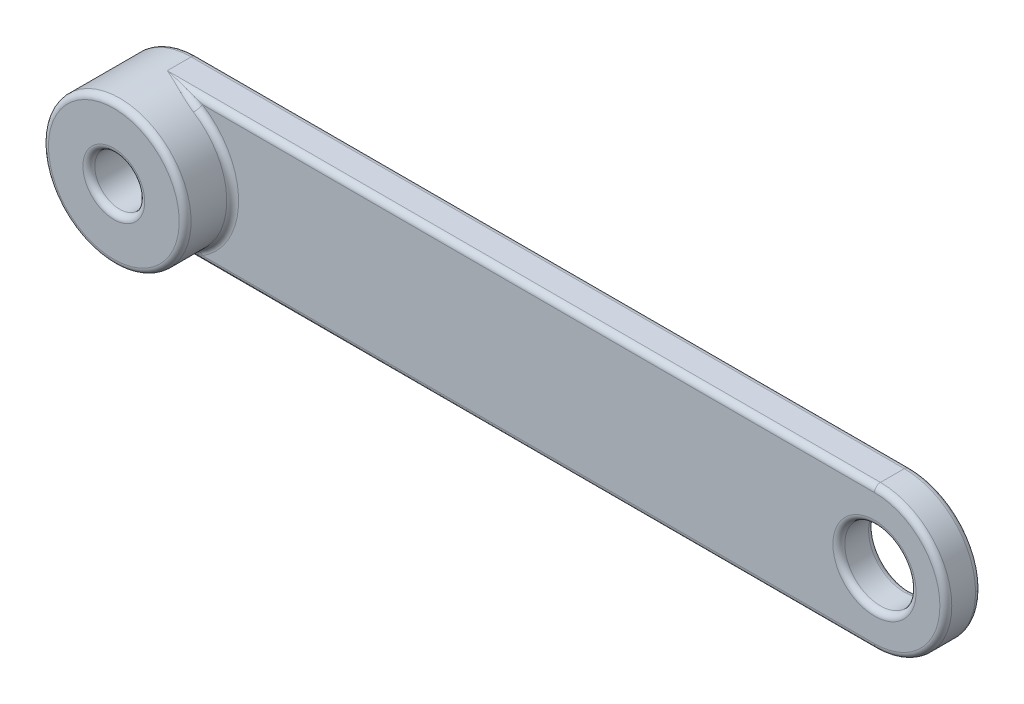
ISO-10303-21;
HEADER;
FILE_DESCRIPTION(('STEP AP214'),'2;1');
FILE_NAME('part.step','',(''),(''),'','','');
FILE_SCHEMA(('AUTOMOTIVE_DESIGN { 1 0 10303 214 1 1 1 1 }'));
ENDSEC;
DATA;
#1=APPLICATION_CONTEXT('core data for automotive mechanical design processes');
#2=APPLICATION_PROTOCOL_DEFINITION('international standard','automotive_design',2000,#1);
#3=PRODUCT_CONTEXT('',#1,'mechanical');
#4=PRODUCT('Part','Part','',(#3));
#5=PRODUCT_RELATED_PRODUCT_CATEGORY('part','',(#4));
#6=PRODUCT_DEFINITION_FORMATION('','',#4);
#7=PRODUCT_DEFINITION_CONTEXT('part definition',#1,'design');
#8=PRODUCT_DEFINITION('design','',#6,#7);
#9=PRODUCT_DEFINITION_SHAPE('','',#8);
#10=(LENGTH_UNIT() NAMED_UNIT(*) SI_UNIT(.MILLI.,.METRE.));
#11=(NAMED_UNIT(*) PLANE_ANGLE_UNIT() SI_UNIT($,.RADIAN.));
#12=(NAMED_UNIT(*) SI_UNIT($,.STERADIAN.) SOLID_ANGLE_UNIT());
#13=UNCERTAINTY_MEASURE_WITH_UNIT(LENGTH_MEASURE(1.E-05),#10,'distance_accuracy_value','');
#14=(GEOMETRIC_REPRESENTATION_CONTEXT(3) GLOBAL_UNCERTAINTY_ASSIGNED_CONTEXT((#13)) GLOBAL_UNIT_ASSIGNED_CONTEXT((#10,
#11,#12)) REPRESENTATION_CONTEXT('',''));
#15=CARTESIAN_POINT('',(0.,0.,0.));
#16=DIRECTION('',(0.,0.,1.));
#17=DIRECTION('',(1.,0.,0.));
#18=AXIS2_PLACEMENT_3D('',#15,#16,#17);
#19=CARTESIAN_POINT('',(-30.,0.,1.5));
#20=DIRECTION('',(0.,0.,-1.));
#21=DIRECTION('',(-1.,0.,0.));
#22=AXIS2_PLACEMENT_3D('',#19,#20,#21);
#23=CYLINDRICAL_SURFACE('',#22,6.);
#24=CARTESIAN_POINT('',(-30.,0.,5.));
#25=DIRECTION('',(0.,0.,-1.));
#26=DIRECTION('',(-1.,0.,0.));
#27=AXIS2_PLACEMENT_3D('',#24,#25,#26);
#28=CIRCLE('',#27,6.);
#29=CARTESIAN_POINT('',(-36.,0.,5.));
#30=VERTEX_POINT('',#29);
#31=EDGE_CURVE('E153',#30,#30,#28,.T.);
#32=ORIENTED_EDGE('',*,*,#31,.T.);
#33=EDGE_LOOP('',(#32));
#34=FACE_BOUND('',#33,.T.);
#35=DIRECTION('',(0.,0.,-1.));
#36=VECTOR('',#35,1.);
#37=CARTESIAN_POINT('',(-30.,6.00000000000001,1.5));
#38=LINE('',#37,#36);
#39=CARTESIAN_POINT('',(-30.,6.00000000000001,1.));
#40=VERTEX_POINT('',#39);
#41=CARTESIAN_POINT('',(-30.,6.,-0.999999999999999));
#42=VERTEX_POINT('',#41);
#43=EDGE_CURVE('E339',#40,#42,#38,.T.);
#44=ORIENTED_EDGE('',*,*,#43,.T.);
#45=CARTESIAN_POINT('',(-30.,0.,-0.999999999999999));
#46=DIRECTION('',(0.,0.,-1.));
#47=DIRECTION('',(-1.,0.,0.));
#48=AXIS2_PLACEMENT_3D('',#45,#46,#47);
#49=CIRCLE('',#48,6.);
#50=CARTESIAN_POINT('',(-30.,-6.00000000000001,-1.));
#51=VERTEX_POINT('',#50);
#52=EDGE_CURVE('E125',#42,#51,#49,.F.);
#53=ORIENTED_EDGE('',*,*,#52,.T.);
#54=DIRECTION('',(0.,0.,-1.));
#55=VECTOR('',#54,1.);
#56=CARTESIAN_POINT('',(-30.,-6.00000000000001,1.5));
#57=LINE('',#56,#55);
#58=CARTESIAN_POINT('',(-30.,-6.00000000000001,1.));
#59=VERTEX_POINT('',#58);
#60=EDGE_CURVE('E359',#59,#51,#57,.T.);
#61=ORIENTED_EDGE('',*,*,#60,.F.);
#62=CARTESIAN_POINT('',(-25.8268408840023,-5.2417234493702,1.4281275784095));
#63=CARTESIAN_POINT('',(-26.3583472022783,-4.77637344463434,1.1473958523543));
#64=CARTESIAN_POINT('',(-26.1478531236945,-4.60010482960654,1.85625515681899));
#65=CARTESIAN_POINT('',(-25.8673671934308,-5.2586965378651,1.43835454177282));
#66=CARTESIAN_POINT('',(-26.372872471598,-4.78568212542629,1.17776714933696));
#67=CARTESIAN_POINT('',(-26.185262024713,-4.63143976220089,1.87670908356606));
#68=CARTESIAN_POINT('',(-25.9090309722364,-5.27571566997727,1.44726047927923));
#69=CARTESIAN_POINT('',(-26.3910628459744,-4.79815975194874,1.20769019053175));
#70=CARTESIAN_POINT('',(-26.2237208974781,-4.66285969837828,1.89452095857847));
#71=CARTESIAN_POINT('',(-25.9941839317077,-5.30960809533619,1.46270853892782));
#72=CARTESIAN_POINT('',(-26.4333157613817,-4.82770579735428,1.26427303137202));
#73=CARTESIAN_POINT('',(-26.302323629337,-4.72543032975726,1.92541707786636));
#74=CARTESIAN_POINT('',(-26.0376696969826,-5.32648159572286,1.46925488079843));
#75=CARTESIAN_POINT('',(-26.4571741461562,-4.84461378336566,1.29106524661812));
#76=CARTESIAN_POINT('',(-26.3424643357624,-4.75658140737101,1.93850976159872));
#77=CARTESIAN_POINT('',(-26.1697780837766,-5.37638026134648,1.48573826261766));
#78=CARTESIAN_POINT('',(-26.534395580874,-4.89897560214354,1.36404872526141));
#79=CARTESIAN_POINT('',(-26.4644105389578,-4.84870202083378,1.97147652524749));
#80=CARTESIAN_POINT('',(-26.2606434346254,-5.40893272140954,1.49265759646182));
#81=CARTESIAN_POINT('',(-26.595430798128,-4.94154108186714,1.40656030700251));
#82=CARTESIAN_POINT('',(-26.5482862473656,-4.90879887027987,1.98531519299122));
#83=CARTESIAN_POINT('',(-26.4134752909856,-5.46072669076056,1.49887527568896));
#84=CARTESIAN_POINT('',(-26.7074093848877,-5.01616008878756,1.46398630583139));
#85=CARTESIAN_POINT('',(-26.6893618070512,-5.00441850602902,1.99775055133412));
#86=CARTESIAN_POINT('',(-26.4743561226722,-5.48062041523498,1.49999883563985));
#87=CARTESIAN_POINT('',(-26.7534928343281,-5.04614544219106,1.48333745346678));
#88=CARTESIAN_POINT('',(-26.7455594978471,-5.04114538195593,1.99999767114047));
#89=CARTESIAN_POINT('',(-26.6289831336316,-5.52931227606701,1.50000176113402));
#90=CARTESIAN_POINT('',(-26.8733206021174,-5.12160370091638,1.52418941490809));
#91=CARTESIAN_POINT('',(-26.8882921233585,-5.13103804814845,2.00000352247864));
#92=CARTESIAN_POINT('',(-26.7235810755598,-5.55744832471949,1.49743575238046));
#93=CARTESIAN_POINT('',(-26.9505590496853,-5.16820580350775,1.54284316223929));
#94=CARTESIAN_POINT('',(-26.9756133005201,-5.18298152270507,1.994871505719));
#95=CARTESIAN_POINT('',(-26.914931107936,-5.61113776116167,1.48825118000046));
#96=CARTESIAN_POINT('',(-27.1111991972513,-5.2597571019407,1.56864425939782));
#97=CARTESIAN_POINT('',(-27.1522440996335,-5.28210048230655,1.9765023610341));
#98=CARTESIAN_POINT('',(-27.0116854995996,-5.63668821122262,1.48162806565832));
#99=CARTESIAN_POINT('',(-27.1947072476474,-5.30497014855636,1.57630037178346));
#100=CARTESIAN_POINT('',(-27.2415558457843,-5.32927054385192,1.96325613167586));
#101=CARTESIAN_POINT('',(-27.3051803854011,-5.7095494740419,1.45687863424466));
#102=CARTESIAN_POINT('',(-27.4478519633026,-5.43367409033778,1.58508002276793));
#103=CARTESIAN_POINT('',(-27.5124742019086,-5.46378364427197,1.91375726776781));
#104=CARTESIAN_POINT('',(-27.5043481433092,-5.75281817237951,1.43388757204404));
#105=CARTESIAN_POINT('',(-27.6296713116609,-5.51607846569451,1.57405141840404));
#106=CARTESIAN_POINT('',(-27.6963213630545,-5.54366431821186,1.86777514391479));
#107=CARTESIAN_POINT('',(-27.8653562444533,-5.8209409077268,1.38519217328389));
#108=CARTESIAN_POINT('',(-27.9642061406852,-5.64662435934083,1.53188622600754));
#109=CARTESIAN_POINT('',(-28.0295596102646,-5.66942936813278,1.77038434670608));
#110=CARTESIAN_POINT('',(-28.0266105291593,-5.84774915638199,1.36097386601165));
#111=CARTESIAN_POINT('',(-28.1153382598131,-5.69895233175846,1.50593615186114));
#112=CARTESIAN_POINT('',(-28.178409719224,-5.71892151948061,1.72194773206113));
#113=CARTESIAN_POINT('',(-28.3506697671448,-5.89476439851586,1.30885717255693));
#114=CARTESIAN_POINT('',(-28.4201181333635,-5.79067626066335,1.44363937827826));
#115=CARTESIAN_POINT('',(-28.4775413235182,-5.80571888956158,1.617714345076));
#116=CARTESIAN_POINT('',(-28.5134757372153,-5.91496670612985,1.28095619371133));
#117=CARTESIAN_POINT('',(-28.5749512864212,-5.83081276881281,1.40732746015369));
#118=CARTESIAN_POINT('',(-28.6278237574295,-5.84301545746757,1.56191238740966));
#119=CARTESIAN_POINT('',(-29.0025663998118,-5.96581527756157,1.19375640344163));
#120=CARTESIAN_POINT('',(-29.0356799341919,-5.93016135558233,1.28967239825727));
#121=CARTESIAN_POINT('',(-29.0792920613647,-5.93688974319644,1.38751280690919));
#122=CARTESIAN_POINT('',(-29.3304768365896,-5.98687963922541,1.13081741364892));
#123=CARTESIAN_POINT('',(-29.3549034633228,-5.97359987418577,1.19600869864387));
#124=CARTESIAN_POINT('',(-29.3819786183904,-5.9757777955035,1.26163482730256));
#125=CARTESIAN_POINT('',(-29.7672144038785,-5.99837220310204,1.04564475566124));
#126=CARTESIAN_POINT('',(-29.7760007242307,-5.99676311743804,1.06851877425367));
#127=CARTESIAN_POINT('',(-29.7851209881955,-5.99699483649918,1.09128951132188));
#128=CARTESIAN_POINT('',(-29.8760954071364,-5.99986561989369,1.02429932736857));
#129=CARTESIAN_POINT('',(-29.8808536382594,-5.99973215836689,1.03645125822823));
#130=CARTESIAN_POINT('',(-29.8856265296643,-5.99975191365006,1.0485986547371));
#131=CARTESIAN_POINT('',(-29.9899925634816,-5.99999710987088,1.00196262513987));
#132=CARTESIAN_POINT('',(-29.9903774426869,-5.99999417667157,1.00294392982162));
#133=CARTESIAN_POINT('',(-29.9907623662907,-5.99999466437702,1.00392525027975));
#134=CARTESIAN_POINT('',(-29.9949962676414,-5.99999999863019,1.00098131825672));
#135=CARTESIAN_POINT('',(-29.9951887124621,-5.99999995300205,1.00147196401252));
#136=CARTESIAN_POINT('',(-29.9953811701305,-5.99999999747114,1.00196263651345));
#137=CARTESIAN_POINT('',(-30.,-5.99999999999999,1.));
#138=CARTESIAN_POINT('',(-30.,-5.99999999999999,1.));
#139=CARTESIAN_POINT('',(-30.,-6.,1.));
#140=(BOUNDED_SURFACE() B_SPLINE_SURFACE(3,2,((#62,#63,#64),(#65,#66,#67),(#68,#69,#70),(#71,
#72,#73),(#74,#75,#76),(#77,#78,#79),(#80,#81,#82),(#83,#84,#85),(#86,#87,#88),(#89,#90,#91),
(#92,#93,#94),(#95,#96,#97),(#98,#99,#100),(#101,#102,#103),(#104,#105,#106),(#107,#108,#109),
(#110,#111,#112),(#113,#114,#115),(#116,#117,#118),(#119,#120,#121),(#122,#123,#124),(#125,#126,
#127),(#128,#129,#130),(#131,#132,#133),(#134,#135,#136),(#137,#138,#139)),.UNSPECIFIED.,.F.,
.F.,.F.) B_SPLINE_SURFACE_WITH_KNOTS((4,2,2,2,2,2,2,2,2,2,2,2,4),(3,3),(0.,0.16984709042055,
0.339388913804842,0.676038526408734,0.894192400445608,1.22415749817049,1.55449338582018,
2.21798174140298,2.7474553691667,3.27730376361803,4.33386759061956,4.68478059100202,
4.70090511581507),(0.,1.),
.UNSPECIFIED.) GEOMETRIC_REPRESENTATION_ITEM() RATIONAL_B_SPLINE_SURFACE(((1.,0.549530222413328,
1.),(1.,0.560143299283935,1.),(1.,0.570719244706879,1.),(1.,0.591670480785608,1.),(1.,
0.602046097915688,1.),(1.,0.632593871750217,1.),(1.,0.652342083902754,1.),(1.,0.683568803832132,
1.),(1.,0.695511447475862,1.),(1.,0.724645114795777,1.),(1.,0.74138888720478,1.),(1.,
0.773221470254066,1.),(1.,0.788308400029641,1.),(1.,0.831213767976823,1.),(1.,0.856526967259593,
1.),(1.,0.896262729252152,1.),(1.,0.911852310831275,1.),(1.,0.939147496412512,1.),(1.,
0.950850343486455,1.),(1.,0.980280004949531,1.),(1.,0.992430307527187,1.),(1.,0.999060631586975,
1.),(1.,0.99992246197761,1.),(1.,0.999998333124029,1.),(1.,0.999999999731678,1.),(1.,1.,1.))) REPRESENTATION_ITEM('') SURFACE());
#141=CARTESIAN_POINT('',(-26.1478531236945,-4.60010482960654,1.85625515681899));
#142=CARTESIAN_POINT('',(-26.185262024713,-4.63143976220089,1.87670908356606));
#143=CARTESIAN_POINT('',(-26.2237208974781,-4.66285969837828,1.89452095857847));
#144=CARTESIAN_POINT('',(-26.302323629337,-4.72543032975726,1.92541707786636));
#145=CARTESIAN_POINT('',(-26.3424643357624,-4.75658140737101,1.93850976159872));
#146=CARTESIAN_POINT('',(-26.4644105389578,-4.84870202083378,1.97147652524749));
#147=CARTESIAN_POINT('',(-26.5482862473656,-4.90879887027987,1.98531519299122));
#148=CARTESIAN_POINT('',(-26.6893618070512,-5.00441850602902,1.99775055133412));
#149=CARTESIAN_POINT('',(-26.7455594978471,-5.04114538195593,1.99999767114047));
#150=CARTESIAN_POINT('',(-26.8882921233585,-5.13103804814845,2.00000352247864));
#151=CARTESIAN_POINT('',(-26.9756133005201,-5.18298152270507,1.994871505719));
#152=CARTESIAN_POINT('',(-27.1522440996335,-5.28210048230655,1.9765023610341));
#153=CARTESIAN_POINT('',(-27.2415558457843,-5.32927054385192,1.96325613167586));
#154=CARTESIAN_POINT('',(-27.5124742019086,-5.46378364427197,1.91375726776781));
#155=CARTESIAN_POINT('',(-27.6963213630546,-5.54366431821186,1.86777514391479));
#156=CARTESIAN_POINT('',(-28.0295596102646,-5.66942936813278,1.77038434670608));
#157=CARTESIAN_POINT('',(-28.178409719224,-5.71892151948061,1.72194773206113));
#158=CARTESIAN_POINT('',(-28.4775413235182,-5.80571888956158,1.617714345076));
#159=CARTESIAN_POINT('',(-28.6278237574295,-5.84301545746757,1.56191238740966));
#160=CARTESIAN_POINT('',(-29.0792920613647,-5.93688974319644,1.38751280690919));
#161=CARTESIAN_POINT('',(-29.3819786183904,-5.97577779550351,1.26163482730256));
#162=CARTESIAN_POINT('',(-29.7851209881955,-5.99699483649918,1.09128951132188));
#163=CARTESIAN_POINT('',(-29.8856265296643,-5.99975191365006,1.0485986547371));
#164=CARTESIAN_POINT('',(-29.9907623662907,-5.99999466437702,1.00392525027975));
#165=CARTESIAN_POINT('',(-29.9953811701305,-5.99999999747114,1.00196263651345));
#166=CARTESIAN_POINT('',(-30.,-6.,1.));
#167=B_SPLINE_CURVE_WITH_KNOTS('',3,(#141,#142,#143,#144,#145,#146,#147,#148,#149,#150,#151,
#152,#153,#154,#155,#156,#157,#158,#159,#160,#161,#162,#163,#164,#165,#166),.UNSPECIFIED.,.F.,
.F.,(4,2,2,2,2,2,2,2,2,2,2,2,4),(0.,0.16984709042055,0.339388913804842,0.676038526408734,
0.894192400445608,1.22415749817049,1.55449338582018,2.21798174140298,2.7474553691667,
3.27730376361803,4.33386759061956,4.68478059100202,4.70090511581507),.UNSPECIFIED.);
#168=CARTESIAN_POINT('',(-26.8023677398729,-5.07692307692306,2.));
#169=VERTEX_POINT('',#168);
#170=EDGE_CURVE('E209',#59,#169,#167,.F.);
#171=ORIENTED_EDGE('',*,*,#170,.T.);
#172=CARTESIAN_POINT('',(-30.,0.,2.));
#173=DIRECTION('',(0.,0.,-1.));
#174=DIRECTION('',(-1.,0.,0.));
#175=AXIS2_PLACEMENT_3D('',#172,#173,#174);
#176=CIRCLE('',#175,6.);
#177=CARTESIAN_POINT('',(-26.8023677398729,5.07692307692308,2.));
#178=VERTEX_POINT('',#177);
#179=EDGE_CURVE('E149',#169,#178,#176,.F.);
#180=ORIENTED_EDGE('',*,*,#179,.T.);
#181=CARTESIAN_POINT('',(-26.1478531236945,4.60010482960654,1.85625515681899));
#182=CARTESIAN_POINT('',(-26.3583472022783,4.77637344463433,1.14739585235427));
#183=CARTESIAN_POINT('',(-25.8268408840023,5.24172344937021,1.42812757840949));
#184=CARTESIAN_POINT('',(-26.185262024713,4.63143976220088,1.87670908356605));
#185=CARTESIAN_POINT('',(-26.372872471598,4.78568212542629,1.17776714933692));
#186=CARTESIAN_POINT('',(-25.8673671934307,5.2586965378651,1.43835454177281));
#187=CARTESIAN_POINT('',(-26.2237208974781,4.66285969837827,1.89452095857846));
#188=CARTESIAN_POINT('',(-26.3910628459744,4.79815975194874,1.20769019053171));
#189=CARTESIAN_POINT('',(-25.9090309722364,5.27571566997727,1.44726047927922));
#190=CARTESIAN_POINT('',(-26.302323629337,4.72543032975723,1.92541707786634));
#191=CARTESIAN_POINT('',(-26.4333157613816,4.82770579735426,1.26427303137197));
#192=CARTESIAN_POINT('',(-25.9941839317076,5.30960809533618,1.46270853892781));
#193=CARTESIAN_POINT('',(-26.3424643357623,4.75658140737097,1.9385097615987));
#194=CARTESIAN_POINT('',(-26.4571741461562,4.84461378336563,1.29106524661806));
#195=CARTESIAN_POINT('',(-26.0376696969825,5.32648159572284,1.46925488079842));
#196=CARTESIAN_POINT('',(-26.4644105389578,4.84870202083375,1.97147652524748));
#197=CARTESIAN_POINT('',(-26.5343955808739,4.89897560214351,1.36404872526137));
#198=CARTESIAN_POINT('',(-26.1697780837766,5.37638026134646,1.48573826261765));
#199=CARTESIAN_POINT('',(-26.5482862473656,4.90879887027986,1.98531519299122));
#200=CARTESIAN_POINT('',(-26.595430798128,4.94154108186713,1.40656030700249));
#201=CARTESIAN_POINT('',(-26.2606434346254,5.40893272140954,1.49265759646182));
#202=CARTESIAN_POINT('',(-26.6893618070512,5.00441850602902,1.99775055133412));
#203=CARTESIAN_POINT('',(-26.7074093848877,5.01616008878756,1.46398630583139));
#204=CARTESIAN_POINT('',(-26.4134752909855,5.46072669076057,1.49887527568896));
#205=CARTESIAN_POINT('',(-26.7455594978471,5.04114538195593,1.99999767114048));
#206=CARTESIAN_POINT('',(-26.7534928343281,5.04614544219106,1.48333745346678));
#207=CARTESIAN_POINT('',(-26.4743561226722,5.48062041523498,1.49999883563985));
#208=CARTESIAN_POINT('',(-26.8882921233585,5.13103804814843,2.00000352247864));
#209=CARTESIAN_POINT('',(-26.8733206021173,5.12160370091636,1.52418941490807));
#210=CARTESIAN_POINT('',(-26.6289831336315,5.52931227606701,1.50000176113402));
#211=CARTESIAN_POINT('',(-26.97561330052,5.18298152270504,1.994871505719));
#212=CARTESIAN_POINT('',(-26.9505590496853,5.16820580350771,1.54284316223927));
#213=CARTESIAN_POINT('',(-26.7235810755598,5.55744832471947,1.49743575238046));
#214=CARTESIAN_POINT('',(-27.1522440996334,5.28210048230649,1.97650236103412));
#215=CARTESIAN_POINT('',(-27.1111991972512,5.25975710194063,1.5686442593978));
#216=CARTESIAN_POINT('',(-26.9149311079359,5.61113776116164,1.48825118000047));
#217=CARTESIAN_POINT('',(-27.2415558457842,5.32927054385185,1.96325613167589));
#218=CARTESIAN_POINT('',(-27.1947072476473,5.30497014855629,1.57630037178345));
#219=CARTESIAN_POINT('',(-27.0116854995994,5.63668821122259,1.48162806565833));
#220=CARTESIAN_POINT('',(-27.5124742019084,5.46378364427192,1.91375726776783));
#221=CARTESIAN_POINT('',(-27.4478519633024,5.43367409033772,1.58508002276792));
#222=CARTESIAN_POINT('',(-27.305180385401,5.70954947404188,1.45687863424467));
#223=CARTESIAN_POINT('',(-27.6963213630545,5.54366431821183,1.86777514391474));
#224=CARTESIAN_POINT('',(-27.6296713116608,5.51607846569448,1.57405141840398));
#225=CARTESIAN_POINT('',(-27.504348143309,5.7528181723795,1.43388757204402));
#226=CARTESIAN_POINT('',(-28.0295596102646,5.66942936813278,1.77038434670614));
#227=CARTESIAN_POINT('',(-27.9642061406852,5.64662435934082,1.53188622600758));
#228=CARTESIAN_POINT('',(-27.8653562444533,5.82094090772681,1.38519217328392));
#229=CARTESIAN_POINT('',(-28.1784097192241,5.71892151948062,1.72194773206132));
#230=CARTESIAN_POINT('',(-28.1153382598132,5.69895233175846,1.5059361518613));
#231=CARTESIAN_POINT('',(-28.0266105291594,5.84774915638199,1.36097386601174));
#232=CARTESIAN_POINT('',(-28.4775413235183,5.80571888956161,1.61771434507579));
#233=CARTESIAN_POINT('',(-28.4201181333635,5.79067626066338,1.4436393782781));
#234=CARTESIAN_POINT('',(-28.3506697671448,5.89476439851588,1.30885717255682));
#235=CARTESIAN_POINT('',(-28.6278237574294,5.8430154574676,1.56191238740891));
#236=CARTESIAN_POINT('',(-28.574951286421,5.83081276881285,1.40732746015311));
#237=CARTESIAN_POINT('',(-28.5134757372151,5.91496670612987,1.28095619371096));
#238=CARTESIAN_POINT('',(-29.0792920613653,5.93688974319645,1.38751280691058));
#239=CARTESIAN_POINT('',(-29.0356799341926,5.93016135558232,1.28967239825833));
#240=CARTESIAN_POINT('',(-29.0025663998124,5.96581527756158,1.19375640344232));
#241=CARTESIAN_POINT('',(-29.3819786183932,5.9757777955035,1.26163482731027));
#242=CARTESIAN_POINT('',(-29.3549034633257,5.97359987418563,1.1960086986497));
#243=CARTESIAN_POINT('',(-29.3304768365926,5.9868796392254,1.13081741365277));
#244=CARTESIAN_POINT('',(-29.7851209881946,5.99699483649918,1.09128951131929));
#245=CARTESIAN_POINT('',(-29.7760007242297,5.99676311743809,1.06851877425173));
#246=CARTESIAN_POINT('',(-29.7672144038774,5.99837220310205,1.04564475565995));
#247=CARTESIAN_POINT('',(-29.8856265296619,5.99975191365006,1.04859865473039));
#248=CARTESIAN_POINT('',(-29.8808536382569,5.99973215836702,1.03645125822319));
#249=CARTESIAN_POINT('',(-29.8760954071337,5.99986561989371,1.02429932736521));
#250=CARTESIAN_POINT('',(-29.9907623662905,5.99999466437702,1.00392525027914));
#251=CARTESIAN_POINT('',(-29.9903774426867,5.99999417667159,1.00294392982116));
#252=CARTESIAN_POINT('',(-29.9899925634814,5.99999710987089,1.00196262513957));
#253=CARTESIAN_POINT('',(-29.9953811701304,5.99999999747114,1.00196263651313));
#254=CARTESIAN_POINT('',(-29.995188712462,5.99999995300207,1.00147196401228));
#255=CARTESIAN_POINT('',(-29.9949962676412,5.9999999986302,1.00098131825657));
#256=CARTESIAN_POINT('',(-30.,6.,1.));
#257=CARTESIAN_POINT('',(-30.,6.00000000000001,1.));
#258=CARTESIAN_POINT('',(-30.,6.,1.));
#259=(BOUNDED_SURFACE() B_SPLINE_SURFACE(3,2,((#181,#182,#183),(#184,#185,#186),(#187,#188,
#189),(#190,#191,#192),(#193,#194,#195),(#196,#197,#198),(#199,#200,#201),(#202,#203,#204),
(#205,#206,#207),(#208,#209,#210),(#211,#212,#213),(#214,#215,#216),(#217,#218,#219),(#220,#221,
#222),(#223,#224,#225),(#226,#227,#228),(#229,#230,#231),(#232,#233,#234),(#235,#236,#237),
(#238,#239,#240),(#241,#242,#243),(#244,#245,#246),(#247,#248,#249),(#250,#251,#252),(#253,#254,
#255),(#256,#257,#258)),.UNSPECIFIED.,.F.,.F.,.F.) B_SPLINE_SURFACE_WITH_KNOTS((4,2,2,2,2,2,2,2,
2,2,2,2,4),(3,3),(0.,0.169847090420508,0.33938891380476,0.676038526408731,0.894192400445595,
1.22415749817038,1.55449338581998,2.21798174140296,2.74745536916673,3.27730376361823,
4.3338675906195,4.68478059100203,4.70090511581507),(0.,1.),
.UNSPECIFIED.) GEOMETRIC_REPRESENTATION_ITEM() RATIONAL_B_SPLINE_SURFACE(((1.,0.549530222413316,
1.),(1.,0.560143299283922,1.),(1.,0.570719244706864,1.),(1.,0.591670480785589,1.),(1.,
0.602046097915665,1.),(1.,0.632593871750198,1.),(1.,0.652342083902743,1.),(1.,0.683568803832126,
1.),(1.,0.695511447475855,1.),(1.,0.724645114795763,1.),(1.,0.741388887204762,1.),(1.,
0.77322147025404,1.),(1.,0.788308400029612,1.),(1.,0.831213767976801,1.),(1.,0.85652696725958,
1.),(1.,0.896262729252147,1.),(1.,0.911852310831273,1.),(1.,0.939147496412515,1.),(1.,
0.950850343486462,1.),(1.,0.98028000494953,1.),(1.,0.992430307527176,1.),(1.,0.999060631586979,
1.),(1.,0.999922461977619,1.),(1.,0.99999833312403,1.),(1.,0.999999999731678,1.),(1.,1.,1.))) REPRESENTATION_ITEM('') SURFACE());
#260=CARTESIAN_POINT('',(-26.1478531236945,4.60010482960654,1.85625515681899));
#261=CARTESIAN_POINT('',(-26.185262024713,4.63143976220088,1.87670908356605));
#262=CARTESIAN_POINT('',(-26.2237208974781,4.66285969837827,1.89452095857846));
#263=CARTESIAN_POINT('',(-26.302323629337,4.72543032975723,1.92541707786634));
#264=CARTESIAN_POINT('',(-26.3424643357623,4.75658140737097,1.9385097615987));
#265=CARTESIAN_POINT('',(-26.4644105389578,4.84870202083375,1.97147652524748));
#266=CARTESIAN_POINT('',(-26.5482862473656,4.90879887027986,1.98531519299122));
#267=CARTESIAN_POINT('',(-26.6893618070512,5.00441850602902,1.99775055133412));
#268=CARTESIAN_POINT('',(-26.7455594978471,5.04114538195593,1.99999767114048));
#269=CARTESIAN_POINT('',(-26.8882921233585,5.13103804814843,2.00000352247864));
#270=CARTESIAN_POINT('',(-26.97561330052,5.18298152270504,1.994871505719));
#271=CARTESIAN_POINT('',(-27.1522440996334,5.28210048230649,1.97650236103412));
#272=CARTESIAN_POINT('',(-27.2415558457842,5.32927054385185,1.96325613167589));
#273=CARTESIAN_POINT('',(-27.5124742019084,5.46378364427192,1.91375726776783));
#274=CARTESIAN_POINT('',(-27.6963213630545,5.54366431821183,1.86777514391474));
#275=CARTESIAN_POINT('',(-28.0295596102646,5.66942936813278,1.77038434670614));
#276=CARTESIAN_POINT('',(-28.1784097192241,5.71892151948062,1.72194773206132));
#277=CARTESIAN_POINT('',(-28.4775413235183,5.80571888956161,1.61771434507579));
#278=CARTESIAN_POINT('',(-28.6278237574294,5.8430154574676,1.56191238740891));
#279=CARTESIAN_POINT('',(-29.0792920613653,5.93688974319646,1.38751280691058));
#280=CARTESIAN_POINT('',(-29.3819786183932,5.9757777955035,1.26163482731027));
#281=CARTESIAN_POINT('',(-29.7851209881946,5.99699483649918,1.09128951131929));
#282=CARTESIAN_POINT('',(-29.8856265296619,5.99975191365006,1.04859865473039));
#283=CARTESIAN_POINT('',(-29.9907623662905,5.99999466437702,1.00392525027914));
#284=CARTESIAN_POINT('',(-29.9953811701304,5.99999999747114,1.00196263651313));
#285=CARTESIAN_POINT('',(-30.,6.,1.));
#286=B_SPLINE_CURVE_WITH_KNOTS('',3,(#260,#261,#262,#263,#264,#265,#266,#267,#268,#269,#270,
#271,#272,#273,#274,#275,#276,#277,#278,#279,#280,#281,#282,#283,#284,#285),.UNSPECIFIED.,.F.,
.F.,(4,2,2,2,2,2,2,2,2,2,2,2,4),(0.,0.169847090420508,0.33938891380476,0.676038526408731,
0.894192400445595,1.22415749817038,1.55449338581998,2.21798174140296,2.74745536916673,
3.27730376361823,4.3338675906195,4.68478059100203,4.70090511581507),.UNSPECIFIED.);
#287=EDGE_CURVE('E218',#178,#40,#286,.T.);
#288=ORIENTED_EDGE('',*,*,#287,.T.);
#289=EDGE_LOOP('',(#44,#53,#61,#171,#180,#288));
#290=FACE_BOUND('',#289,.T.);
#291=ADVANCED_FACE('F44',(#34,#290),#23,.T.);
#292=CARTESIAN_POINT('',(30.,-5.99999999999999,1.5));
#293=DIRECTION('',(0.,-1.,0.));
#294=DIRECTION('',(0.,0.,-1.));
#295=AXIS2_PLACEMENT_3D('',#292,#293,#294);
#296=PLANE('',#295);
#297=ORIENTED_EDGE('',*,*,#60,.T.);
#298=DIRECTION('',(-1.,0.,0.));
#299=VECTOR('',#298,1.);
#300=CARTESIAN_POINT('',(30.,-6.00000000000001,-0.999999999999999));
#301=LINE('',#300,#299);
#302=CARTESIAN_POINT('',(30.,-6.00000000000001,-0.999999999999999));
#303=VERTEX_POINT('',#302);
#304=EDGE_CURVE('E167',#51,#303,#301,.F.);
#305=ORIENTED_EDGE('',*,*,#304,.T.);
#306=DIRECTION('',(0.,0.,-1.));
#307=VECTOR('',#306,1.);
#308=CARTESIAN_POINT('',(30.,-5.99999999999999,1.5));
#309=LINE('',#308,#307);
#310=CARTESIAN_POINT('',(30.,-5.99999999999999,1.));
#311=VERTEX_POINT('',#310);
#312=EDGE_CURVE('E352',#311,#303,#309,.T.);
#313=ORIENTED_EDGE('',*,*,#312,.F.);
#314=DIRECTION('',(-1.,0.,0.));
#315=VECTOR('',#314,1.);
#316=CARTESIAN_POINT('',(-30.,-6.00000000000001,1.));
#317=LINE('',#316,#315);
#318=EDGE_CURVE('E163',#311,#59,#317,.T.);
#319=ORIENTED_EDGE('',*,*,#318,.T.);
#320=EDGE_LOOP('',(#297,#305,#313,#319));
#321=FACE_BOUND('',#320,.T.);
#322=ADVANCED_FACE('F327',(#321),#296,.T.);
#323=CARTESIAN_POINT('',(30.,0.,1.5));
#324=DIRECTION('',(0.,0.,-1.));
#325=DIRECTION('',(-1.,0.,0.));
#326=AXIS2_PLACEMENT_3D('',#323,#324,#325);
#327=CYLINDRICAL_SURFACE('',#326,6.);
#328=ORIENTED_EDGE('',*,*,#312,.T.);
#329=CARTESIAN_POINT('',(30.,0.,-0.999999999999999));
#330=DIRECTION('',(0.,0.,-1.));
#331=DIRECTION('',(-1.,0.,0.));
#332=AXIS2_PLACEMENT_3D('',#329,#330,#331);
#333=CIRCLE('',#332,6.);
#334=CARTESIAN_POINT('',(30.,6.00000000000001,-0.999999999999997));
#335=VERTEX_POINT('',#334);
#336=EDGE_CURVE('E173',#303,#335,#333,.F.);
#337=ORIENTED_EDGE('',*,*,#336,.T.);
#338=DIRECTION('',(0.,0.,-1.));
#339=VECTOR('',#338,1.);
#340=CARTESIAN_POINT('',(30.,6.00000000000001,1.5));
#341=LINE('',#340,#339);
#342=CARTESIAN_POINT('',(30.,6.00000000000001,1.));
#343=VERTEX_POINT('',#342);
#344=EDGE_CURVE('E346',#343,#335,#341,.T.);
#345=ORIENTED_EDGE('',*,*,#344,.F.);
#346=CARTESIAN_POINT('',(30.,0.,1.));
#347=DIRECTION('',(0.,0.,-1.));
#348=DIRECTION('',(-1.,0.,0.));
#349=AXIS2_PLACEMENT_3D('',#346,#347,#348);
#350=CIRCLE('',#349,6.);
#351=EDGE_CURVE('E170',#343,#311,#350,.T.);
#352=ORIENTED_EDGE('',*,*,#351,.T.);
#353=EDGE_LOOP('',(#328,#337,#345,#352));
#354=FACE_BOUND('',#353,.T.);
#355=ADVANCED_FACE('F332',(#354),#327,.T.);
#356=CARTESIAN_POINT('',(-30.,6.00000000000001,1.5));
#357=DIRECTION('',(0.,1.,0.));
#358=DIRECTION('',(0.,0.,1.));
#359=AXIS2_PLACEMENT_3D('',#356,#357,#358);
#360=PLANE('',#359);
#361=ORIENTED_EDGE('',*,*,#344,.T.);
#362=DIRECTION('',(1.,0.,0.));
#363=VECTOR('',#362,1.);
#364=CARTESIAN_POINT('',(-30.,6.,-0.999999999999999));
#365=LINE('',#364,#363);
#366=EDGE_CURVE('E194',#335,#42,#365,.F.);
#367=ORIENTED_EDGE('',*,*,#366,.T.);
#368=ORIENTED_EDGE('',*,*,#43,.F.);
#369=DIRECTION('',(1.,0.,0.));
#370=VECTOR('',#369,1.);
#371=CARTESIAN_POINT('',(30.,6.,1.));
#372=LINE('',#371,#370);
#373=EDGE_CURVE('E191',#40,#343,#372,.T.);
#374=ORIENTED_EDGE('',*,*,#373,.T.);
#375=EDGE_LOOP('',(#361,#367,#368,#374));
#376=FACE_BOUND('',#375,.T.);
#377=ADVANCED_FACE('F425',(#376),#360,.T.);
#378=CARTESIAN_POINT('',(-30.,0.,1.5));
#379=DIRECTION('',(0.,0.,-1.));
#380=DIRECTION('',(-1.,0.,0.));
#381=AXIS2_PLACEMENT_3D('',#378,#379,#380);
#382=PLANE('',#381);
#383=CARTESIAN_POINT('',(30.,0.,1.5));
#384=DIRECTION('',(0.,0.,-1.));
#385=DIRECTION('',(-1.,0.,0.));
#386=AXIS2_PLACEMENT_3D('',#383,#384,#385);
#387=CIRCLE('',#386,3.5);
#388=CARTESIAN_POINT('',(26.5,0.,1.5));
#389=VERTEX_POINT('',#388);
#390=EDGE_CURVE('E187',#389,#389,#387,.T.);
#391=ORIENTED_EDGE('',*,*,#390,.T.);
#392=EDGE_LOOP('',(#391));
#393=FACE_BOUND('',#392,.T.);
#394=CARTESIAN_POINT('',(-30.,0.,1.5));
#395=DIRECTION('',(0.,0.,-1.));
#396=DIRECTION('',(-1.,0.,0.));
#397=AXIS2_PLACEMENT_3D('',#394,#395,#396);
#398=CIRCLE('',#397,6.5);
#399=CARTESIAN_POINT('',(-26.5358983848623,5.50000000000001,1.5));
#400=VERTEX_POINT('',#399);
#401=CARTESIAN_POINT('',(-26.5358983848623,-5.50000000000001,1.5));
#402=VERTEX_POINT('',#401);
#403=EDGE_CURVE('E176',#400,#402,#398,.T.);
#404=ORIENTED_EDGE('',*,*,#403,.T.);
#405=DIRECTION('',(-1.,0.,0.));
#406=VECTOR('',#405,1.);
#407=CARTESIAN_POINT('',(30.,-5.49999999999998,1.5));
#408=LINE('',#407,#406);
#409=CARTESIAN_POINT('',(30.,-5.49999999999998,1.5));
#410=VERTEX_POINT('',#409);
#411=EDGE_CURVE('E184',#402,#410,#408,.F.);
#412=ORIENTED_EDGE('',*,*,#411,.T.);
#413=CARTESIAN_POINT('',(30.,0.,1.5));
#414=DIRECTION('',(0.,0.,-1.));
#415=DIRECTION('',(-1.,0.,0.));
#416=AXIS2_PLACEMENT_3D('',#413,#414,#415);
#417=CIRCLE('',#416,5.5);
#418=CARTESIAN_POINT('',(30.,5.50000000000002,1.5));
#419=VERTEX_POINT('',#418);
#420=EDGE_CURVE('E67',#410,#419,#417,.F.);
#421=ORIENTED_EDGE('',*,*,#420,.T.);
#422=DIRECTION('',(1.,0.,0.));
#423=VECTOR('',#422,1.);
#424=CARTESIAN_POINT('',(-30.,5.5,1.5));
#425=LINE('',#424,#423);
#426=EDGE_CURVE('E179',#419,#400,#425,.F.);
#427=ORIENTED_EDGE('',*,*,#426,.T.);
#428=EDGE_LOOP('',(#404,#412,#421,#427));
#429=FACE_BOUND('',#428,.T.);
#430=ADVANCED_FACE('F399',(#393,#429),#382,.F.);
#431=CARTESIAN_POINT('',(-30.,0.,-1.5));
#432=DIRECTION('',(0.,0.,-1.));
#433=DIRECTION('',(-1.,0.,0.));
#434=AXIS2_PLACEMENT_3D('',#431,#432,#433);
#435=PLANE('',#434);
#436=CARTESIAN_POINT('',(-30.,0.,-1.5));
#437=DIRECTION('',(0.,0.,-1.));
#438=DIRECTION('',(-1.,0.,0.));
#439=AXIS2_PLACEMENT_3D('',#436,#437,#438);
#440=CIRCLE('',#439,2.6);
#441=CARTESIAN_POINT('',(-32.6,0.,-1.5));
#442=VERTEX_POINT('',#441);
#443=EDGE_CURVE('E53',#442,#442,#440,.F.);
#444=ORIENTED_EDGE('',*,*,#443,.T.);
#445=EDGE_LOOP('',(#444));
#446=FACE_BOUND('',#445,.T.);
#447=DIRECTION('',(-1.,0.,0.));
#448=VECTOR('',#447,1.);
#449=CARTESIAN_POINT('',(-30.,-5.49999999999999,-1.5));
#450=LINE('',#449,#448);
#451=CARTESIAN_POINT('',(30.,-5.49999999999998,-1.5));
#452=VERTEX_POINT('',#451);
#453=CARTESIAN_POINT('',(-30.,-5.49999999999999,-1.5));
#454=VERTEX_POINT('',#453);
#455=EDGE_CURVE('E146',#452,#454,#450,.T.);
#456=ORIENTED_EDGE('',*,*,#455,.T.);
#457=CARTESIAN_POINT('',(-30.,0.,-1.5));
#458=DIRECTION('',(0.,0.,-1.));
#459=DIRECTION('',(-1.,0.,0.));
#460=AXIS2_PLACEMENT_3D('',#457,#458,#459);
#461=CIRCLE('',#460,5.5);
#462=CARTESIAN_POINT('',(-30.,5.49999999999999,-1.5));
#463=VERTEX_POINT('',#462);
#464=EDGE_CURVE('E123',#454,#463,#461,.T.);
#465=ORIENTED_EDGE('',*,*,#464,.T.);
#466=DIRECTION('',(1.,0.,0.));
#467=VECTOR('',#466,1.);
#468=CARTESIAN_POINT('',(-30.,5.49999999999999,-1.5));
#469=LINE('',#468,#467);
#470=CARTESIAN_POINT('',(30.,5.50000000000001,-1.5));
#471=VERTEX_POINT('',#470);
#472=EDGE_CURVE('E133',#463,#471,#469,.T.);
#473=ORIENTED_EDGE('',*,*,#472,.T.);
#474=CARTESIAN_POINT('',(30.,0.,-1.5));
#475=DIRECTION('',(0.,0.,-1.));
#476=DIRECTION('',(-1.,0.,0.));
#477=AXIS2_PLACEMENT_3D('',#474,#475,#476);
#478=CIRCLE('',#477,5.5);
#479=EDGE_CURVE('E140',#471,#452,#478,.T.);
#480=ORIENTED_EDGE('',*,*,#479,.T.);
#481=EDGE_LOOP('',(#456,#465,#473,#480));
#482=FACE_BOUND('',#481,.T.);
#483=CARTESIAN_POINT('',(30.,0.,-1.5));
#484=DIRECTION('',(0.,0.,-1.));
#485=DIRECTION('',(-1.,0.,0.));
#486=AXIS2_PLACEMENT_3D('',#483,#484,#485);
#487=CIRCLE('',#486,3.5);
#488=CARTESIAN_POINT('',(26.5,0.,-1.5));
#489=VERTEX_POINT('',#488);
#490=EDGE_CURVE('E141',#489,#489,#487,.F.);
#491=ORIENTED_EDGE('',*,*,#490,.T.);
#492=EDGE_LOOP('',(#491));
#493=FACE_BOUND('',#492,.T.);
#494=ADVANCED_FACE('F143',(#446,#482,#493),#435,.T.);
#495=CARTESIAN_POINT('',(30.,0.,-1.5));
#496=DIRECTION('',(0.,0.,-1.));
#497=DIRECTION('',(-1.,0.,0.));
#498=AXIS2_PLACEMENT_3D('',#495,#496,#497);
#499=CYLINDRICAL_SURFACE('',#498,3.);
#500=CARTESIAN_POINT('',(30.,0.,1.));
#501=DIRECTION('',(0.,0.,-1.));
#502=DIRECTION('',(-1.,0.,0.));
#503=AXIS2_PLACEMENT_3D('',#500,#501,#502);
#504=CIRCLE('',#503,3.);
#505=CARTESIAN_POINT('',(27.,0.,1.));
#506=VERTEX_POINT('',#505);
#507=EDGE_CURVE('E205',#506,#506,#504,.F.);
#508=ORIENTED_EDGE('',*,*,#507,.T.);
#509=EDGE_LOOP('',(#508));
#510=FACE_BOUND('',#509,.T.);
#511=CARTESIAN_POINT('',(30.,0.,-0.999999999999999));
#512=DIRECTION('',(0.,0.,-1.));
#513=DIRECTION('',(-1.,0.,0.));
#514=AXIS2_PLACEMENT_3D('',#511,#512,#513);
#515=CIRCLE('',#514,3.);
#516=CARTESIAN_POINT('',(27.,0.,-0.999999999999999));
#517=VERTEX_POINT('',#516);
#518=EDGE_CURVE('E201',#517,#517,#515,.T.);
#519=ORIENTED_EDGE('',*,*,#518,.T.);
#520=EDGE_LOOP('',(#519));
#521=FACE_BOUND('',#520,.T.);
#522=ADVANCED_FACE('F416',(#510,#521),#499,.F.);
#523=CARTESIAN_POINT('',(-30.,0.,5.5));
#524=DIRECTION('',(0.,0.,-1.));
#525=DIRECTION('',(-1.,0.,0.));
#526=AXIS2_PLACEMENT_3D('',#523,#524,#525);
#527=PLANE('',#526);
#528=CARTESIAN_POINT('',(-30.,0.,5.5));
#529=DIRECTION('',(0.,0.,-1.));
#530=DIRECTION('',(-1.,0.,0.));
#531=AXIS2_PLACEMENT_3D('',#528,#529,#530);
#532=CIRCLE('',#531,2.6);
#533=CARTESIAN_POINT('',(-32.6,0.,5.5));
#534=VERTEX_POINT('',#533);
#535=EDGE_CURVE('E11',#534,#534,#532,.T.);
#536=ORIENTED_EDGE('',*,*,#535,.T.);
#537=EDGE_LOOP('',(#536));
#538=FACE_BOUND('',#537,.T.);
#539=CARTESIAN_POINT('',(-30.,0.,5.5));
#540=DIRECTION('',(0.,0.,-1.));
#541=DIRECTION('',(-1.,0.,0.));
#542=AXIS2_PLACEMENT_3D('',#539,#540,#541);
#543=CIRCLE('',#542,5.5);
#544=CARTESIAN_POINT('',(-35.5,0.,5.5));
#545=VERTEX_POINT('',#544);
#546=EDGE_CURVE('E197',#545,#545,#543,.F.);
#547=ORIENTED_EDGE('',*,*,#546,.T.);
#548=EDGE_LOOP('',(#547));
#549=FACE_BOUND('',#548,.T.);
#550=ADVANCED_FACE('F422',(#538,#549),#527,.F.);
#551=CARTESIAN_POINT('',(30.,0.,-0.999999999999999));
#552=DIRECTION('',(0.,0.,-1.));
#553=DIRECTION('',(-1.,0.,0.));
#554=AXIS2_PLACEMENT_3D('',#551,#552,#553);
#555=TOROIDAL_SURFACE('',#554,5.5,0.5);
#556=CARTESIAN_POINT('',(30.,5.50000000000001,-0.999999999999997));
#557=DIRECTION('',(-1.,0.,0.));
#558=DIRECTION('',(0.,0.,1.));
#559=AXIS2_PLACEMENT_3D('',#556,#557,#558);
#560=CIRCLE('',#559,0.5);
#561=EDGE_CURVE('E136',#335,#471,#560,.T.);
#562=ORIENTED_EDGE('',*,*,#561,.F.);
#563=ORIENTED_EDGE('',*,*,#336,.F.);
#564=CARTESIAN_POINT('',(30.,-5.49999999999998,-0.999999999999999));
#565=DIRECTION('',(-1.,0.,0.));
#566=DIRECTION('',(0.,0.,1.));
#567=AXIS2_PLACEMENT_3D('',#564,#565,#566);
#568=CIRCLE('',#567,0.5);
#569=EDGE_CURVE('E347',#452,#303,#568,.T.);
#570=ORIENTED_EDGE('',*,*,#569,.F.);
#571=ORIENTED_EDGE('',*,*,#479,.F.);
#572=EDGE_LOOP('',(#562,#563,#570,#571));
#573=FACE_BOUND('',#572,.T.);
#574=ADVANCED_FACE('F364',(#573),#555,.T.);
#575=CARTESIAN_POINT('',(-30.,-5.49999999999999,-1.));
#576=DIRECTION('',(-1.,0.,0.));
#577=DIRECTION('',(0.,0.,1.));
#578=AXIS2_PLACEMENT_3D('',#575,#576,#577);
#579=CYLINDRICAL_SURFACE('',#578,0.5);
#580=ORIENTED_EDGE('',*,*,#569,.T.);
#581=ORIENTED_EDGE('',*,*,#304,.F.);
#582=CARTESIAN_POINT('',(-30.,-5.49999999999999,-1.));
#583=DIRECTION('',(-1.,0.,0.));
#584=DIRECTION('',(0.,0.,1.));
#585=AXIS2_PLACEMENT_3D('',#582,#583,#584);
#586=CIRCLE('',#585,0.5);
#587=EDGE_CURVE('E129',#454,#51,#586,.T.);
#588=ORIENTED_EDGE('',*,*,#587,.F.);
#589=ORIENTED_EDGE('',*,*,#455,.F.);
#590=EDGE_LOOP('',(#580,#581,#588,#589));
#591=FACE_BOUND('',#590,.T.);
#592=ADVANCED_FACE('F367',(#591),#579,.T.);
#593=CARTESIAN_POINT('',(-30.,5.49999999999999,-0.999999999999999));
#594=DIRECTION('',(1.,0.,0.));
#595=DIRECTION('',(0.,0.,-1.));
#596=AXIS2_PLACEMENT_3D('',#593,#594,#595);
#597=CYLINDRICAL_SURFACE('',#596,0.5);
#598=ORIENTED_EDGE('',*,*,#561,.T.);
#599=ORIENTED_EDGE('',*,*,#472,.F.);
#600=CARTESIAN_POINT('',(-30.,5.49999999999999,-0.999999999999999));
#601=DIRECTION('',(-1.,0.,0.));
#602=DIRECTION('',(0.,0.,1.));
#603=AXIS2_PLACEMENT_3D('',#600,#601,#602);
#604=CIRCLE('',#603,0.5);
#605=EDGE_CURVE('E119',#42,#463,#604,.T.);
#606=ORIENTED_EDGE('',*,*,#605,.F.);
#607=ORIENTED_EDGE('',*,*,#366,.F.);
#608=EDGE_LOOP('',(#598,#599,#606,#607));
#609=FACE_BOUND('',#608,.T.);
#610=ADVANCED_FACE('F134',(#609),#597,.T.);
#611=CARTESIAN_POINT('',(-30.,0.,-0.999999999999999));
#612=DIRECTION('',(0.,0.,-1.));
#613=DIRECTION('',(-1.,0.,0.));
#614=AXIS2_PLACEMENT_3D('',#611,#612,#613);
#615=TOROIDAL_SURFACE('',#614,5.5,0.5);
#616=ORIENTED_EDGE('',*,*,#587,.T.);
#617=ORIENTED_EDGE('',*,*,#52,.F.);
#618=ORIENTED_EDGE('',*,*,#605,.T.);
#619=ORIENTED_EDGE('',*,*,#464,.F.);
#620=EDGE_LOOP('',(#616,#617,#618,#619));
#621=FACE_BOUND('',#620,.T.);
#622=ADVANCED_FACE('F121',(#621),#615,.T.);
#623=CARTESIAN_POINT('',(-26.5358983848623,5.50000000000001,2.));
#624=DIRECTION('',(-0.846153846153847,0.532938710021191,0.));
#625=DIRECTION('',(-0.532938710021191,-0.846153846153847,0.));
#626=AXIS2_PLACEMENT_3D('',#623,#624,#625);
#627=CIRCLE('',#626,0.5);
#628=EDGE_CURVE('E375',#400,#178,#627,.T.);
#629=ORIENTED_EDGE('',*,*,#628,.F.);
#630=CARTESIAN_POINT('',(-25.8268408840023,5.24172344937021,1.42812757840949));
#631=CARTESIAN_POINT('',(-25.8673671934307,5.2586965378651,1.43835454177281));
#632=CARTESIAN_POINT('',(-25.9090309722364,5.27571566997727,1.44726047927922));
#633=CARTESIAN_POINT('',(-25.9941839317076,5.30960809533618,1.46270853892781));
#634=CARTESIAN_POINT('',(-26.0376696969825,5.32648159572284,1.46925488079842));
#635=CARTESIAN_POINT('',(-26.1697780837766,5.37638026134646,1.48573826261765));
#636=CARTESIAN_POINT('',(-26.2606434346254,5.40893272140954,1.49265759646182));
#637=CARTESIAN_POINT('',(-26.4134752909855,5.46072669076057,1.49887527568896));
#638=CARTESIAN_POINT('',(-26.4743561226722,5.48062041523498,1.49999883563985));
#639=CARTESIAN_POINT('',(-26.6289831336315,5.52931227606701,1.50000176113402));
#640=CARTESIAN_POINT('',(-26.7235810755598,5.55744832471947,1.49743575238046));
#641=CARTESIAN_POINT('',(-26.9149311079359,5.61113776116164,1.48825118000047));
#642=CARTESIAN_POINT('',(-27.0116854995994,5.63668821122259,1.48162806565833));
#643=CARTESIAN_POINT('',(-27.305180385401,5.70954947404188,1.45687863424467));
#644=CARTESIAN_POINT('',(-27.504348143309,5.7528181723795,1.43388757204402));
#645=CARTESIAN_POINT('',(-27.8653562444533,5.82094090772681,1.38519217328392));
#646=CARTESIAN_POINT('',(-28.0266105291594,5.84774915638199,1.36097386601174));
#647=CARTESIAN_POINT('',(-28.3506697671448,5.89476439851588,1.30885717255682));
#648=CARTESIAN_POINT('',(-28.5134757372151,5.91496670612987,1.28095619371096));
#649=CARTESIAN_POINT('',(-29.0025663998124,5.96581527756158,1.19375640344232));
#650=CARTESIAN_POINT('',(-29.3304768365926,5.9868796392254,1.13081741365277));
#651=CARTESIAN_POINT('',(-29.7672144038774,5.99837220310205,1.04564475565995));
#652=CARTESIAN_POINT('',(-29.8760954071337,5.99986561989371,1.02429932736521));
#653=CARTESIAN_POINT('',(-29.9899925634814,5.99999710987089,1.00196262513957));
#654=CARTESIAN_POINT('',(-29.9949962676412,5.9999999986302,1.00098131825657));
#655=CARTESIAN_POINT('',(-30.,6.,1.));
#656=B_SPLINE_CURVE_WITH_KNOTS('',3,(#630,#631,#632,#633,#634,#635,#636,#637,#638,#639,#640,
#641,#642,#643,#644,#645,#646,#647,#648,#649,#650,#651,#652,#653,#654,#655),.UNSPECIFIED.,.F.,
.F.,(4,2,2,2,2,2,2,2,2,2,2,2,4),(0.,0.169847090420508,0.33938891380476,0.676038526408731,
0.894192400445595,1.22415749817038,1.55449338581998,2.21798174140296,2.74745536916673,
3.27730376361823,4.3338675906195,4.68478059100203,4.70090511581507),.UNSPECIFIED.);
#657=EDGE_CURVE('E130',#40,#400,#656,.F.);
#658=ORIENTED_EDGE('',*,*,#657,.F.);
#659=ORIENTED_EDGE('',*,*,#287,.F.);
#660=EDGE_LOOP('',(#629,#658,#659));
#661=FACE_BOUND('',#660,.T.);
#662=ADVANCED_FACE('F274',(#661),#259,.F.);
#663=CARTESIAN_POINT('',(-30.,5.5,1.));
#664=DIRECTION('',(-1.,0.,0.));
#665=DIRECTION('',(0.,0.,1.));
#666=AXIS2_PLACEMENT_3D('',#663,#664,#665);
#667=CYLINDRICAL_SURFACE('',#666,0.5);
#668=ORIENTED_EDGE('',*,*,#657,.T.);
#669=ORIENTED_EDGE('',*,*,#426,.F.);
#670=CARTESIAN_POINT('',(30.,5.50000000000002,1.));
#671=DIRECTION('',(1.,0.,0.));
#672=DIRECTION('',(0.,0.,-1.));
#673=AXIS2_PLACEMENT_3D('',#670,#671,#672);
#674=CIRCLE('',#673,0.5);
#675=EDGE_CURVE('E378',#343,#419,#674,.T.);
#676=ORIENTED_EDGE('',*,*,#675,.F.);
#677=ORIENTED_EDGE('',*,*,#373,.F.);
#678=EDGE_LOOP('',(#668,#669,#676,#677));
#679=FACE_BOUND('',#678,.T.);
#680=ADVANCED_FACE('F269',(#679),#667,.T.);
#681=CARTESIAN_POINT('',(-30.,0.,2.));
#682=DIRECTION('',(0.,0.,-1.));
#683=DIRECTION('',(-1.,0.,0.));
#684=AXIS2_PLACEMENT_3D('',#681,#682,#683);
#685=TOROIDAL_SURFACE('',#684,6.5,0.5);
#686=ORIENTED_EDGE('',*,*,#628,.T.);
#687=ORIENTED_EDGE('',*,*,#179,.F.);
#688=CARTESIAN_POINT('',(-26.5358983848623,-5.50000000000001,2.));
#689=DIRECTION('',(0.846153846153847,0.532938710021192,0.));
#690=DIRECTION('',(-0.532938710021193,0.846153846153846,0.));
#691=AXIS2_PLACEMENT_3D('',#688,#689,#690);
#692=CIRCLE('',#691,0.5);
#693=EDGE_CURVE('E381',#402,#169,#692,.T.);
#694=ORIENTED_EDGE('',*,*,#693,.F.);
#695=ORIENTED_EDGE('',*,*,#403,.F.);
#696=EDGE_LOOP('',(#686,#687,#694,#695));
#697=FACE_BOUND('',#696,.T.);
#698=ADVANCED_FACE('F265',(#697),#685,.F.);
#699=CARTESIAN_POINT('',(30.,0.,1.));
#700=DIRECTION('',(0.,0.,-1.));
#701=DIRECTION('',(-1.,0.,0.));
#702=AXIS2_PLACEMENT_3D('',#699,#700,#701);
#703=TOROIDAL_SURFACE('',#702,5.5,0.5);
#704=ORIENTED_EDGE('',*,*,#675,.T.);
#705=ORIENTED_EDGE('',*,*,#420,.F.);
#706=CARTESIAN_POINT('',(30.,-5.49999999999998,1.));
#707=DIRECTION('',(-1.,0.,0.));
#708=DIRECTION('',(0.,0.,1.));
#709=AXIS2_PLACEMENT_3D('',#706,#707,#708);
#710=CIRCLE('',#709,0.5);
#711=EDGE_CURVE('E60',#311,#410,#710,.T.);
#712=ORIENTED_EDGE('',*,*,#711,.F.);
#713=ORIENTED_EDGE('',*,*,#351,.F.);
#714=EDGE_LOOP('',(#704,#705,#712,#713));
#715=FACE_BOUND('',#714,.T.);
#716=ADVANCED_FACE('F238',(#715),#703,.T.);
#717=ORIENTED_EDGE('',*,*,#693,.T.);
#718=ORIENTED_EDGE('',*,*,#170,.F.);
#719=CARTESIAN_POINT('',(-25.8268408840023,-5.2417234493702,1.4281275784095));
#720=CARTESIAN_POINT('',(-25.8673671934308,-5.2586965378651,1.43835454177282));
#721=CARTESIAN_POINT('',(-25.9090309722364,-5.27571566997727,1.44726047927923));
#722=CARTESIAN_POINT('',(-25.9941839317077,-5.30960809533619,1.46270853892782));
#723=CARTESIAN_POINT('',(-26.0376696969826,-5.32648159572286,1.46925488079843));
#724=CARTESIAN_POINT('',(-26.1697780837766,-5.37638026134648,1.48573826261766));
#725=CARTESIAN_POINT('',(-26.2606434346254,-5.40893272140954,1.49265759646182));
#726=CARTESIAN_POINT('',(-26.4134752909856,-5.46072669076056,1.49887527568896));
#727=CARTESIAN_POINT('',(-26.4743561226722,-5.48062041523498,1.49999883563985));
#728=CARTESIAN_POINT('',(-26.6289831336316,-5.52931227606701,1.50000176113402));
#729=CARTESIAN_POINT('',(-26.7235810755598,-5.55744832471949,1.49743575238046));
#730=CARTESIAN_POINT('',(-26.914931107936,-5.61113776116167,1.48825118000046));
#731=CARTESIAN_POINT('',(-27.0116854995996,-5.63668821122262,1.48162806565832));
#732=CARTESIAN_POINT('',(-27.3051803854011,-5.7095494740419,1.45687863424466));
#733=CARTESIAN_POINT('',(-27.5043481433092,-5.75281817237951,1.43388757204404));
#734=CARTESIAN_POINT('',(-27.8653562444533,-5.8209409077268,1.38519217328389));
#735=CARTESIAN_POINT('',(-28.0266105291593,-5.84774915638199,1.36097386601165));
#736=CARTESIAN_POINT('',(-28.3506697671448,-5.89476439851586,1.30885717255693));
#737=CARTESIAN_POINT('',(-28.5134757372153,-5.91496670612985,1.28095619371133));
#738=CARTESIAN_POINT('',(-29.0025663998118,-5.96581527756157,1.19375640344163));
#739=CARTESIAN_POINT('',(-29.3304768365896,-5.98687963922541,1.13081741364892));
#740=CARTESIAN_POINT('',(-29.7672144038785,-5.99837220310204,1.04564475566124));
#741=CARTESIAN_POINT('',(-29.8760954071364,-5.99986561989369,1.02429932736857));
#742=CARTESIAN_POINT('',(-29.9899925634816,-5.99999710987088,1.00196262513987));
#743=CARTESIAN_POINT('',(-29.9949962676414,-5.99999999863019,1.00098131825672));
#744=CARTESIAN_POINT('',(-30.,-5.99999999999999,1.));
#745=B_SPLINE_CURVE_WITH_KNOTS('',3,(#719,#720,#721,#722,#723,#724,#725,#726,#727,#728,#729,
#730,#731,#732,#733,#734,#735,#736,#737,#738,#739,#740,#741,#742,#743,#744),.UNSPECIFIED.,.F.,
.F.,(4,2,2,2,2,2,2,2,2,2,2,2,4),(0.,0.16984709042055,0.339388913804842,0.676038526408734,
0.894192400445608,1.22415749817049,1.55449338582018,2.21798174140298,2.7474553691667,
3.27730376361803,4.33386759061956,4.68478059100202,4.70090511581507),.UNSPECIFIED.);
#746=EDGE_CURVE('E253',#402,#59,#745,.T.);
#747=ORIENTED_EDGE('',*,*,#746,.F.);
#748=EDGE_LOOP('',(#717,#718,#747));
#749=FACE_BOUND('',#748,.T.);
#750=ADVANCED_FACE('F231',(#749),#140,.F.);
#751=CARTESIAN_POINT('',(30.,-5.49999999999998,1.));
#752=DIRECTION('',(1.,0.,0.));
#753=DIRECTION('',(0.,0.,-1.));
#754=AXIS2_PLACEMENT_3D('',#751,#752,#753);
#755=CYLINDRICAL_SURFACE('',#754,0.5);
#756=ORIENTED_EDGE('',*,*,#711,.T.);
#757=ORIENTED_EDGE('',*,*,#411,.F.);
#758=ORIENTED_EDGE('',*,*,#746,.T.);
#759=ORIENTED_EDGE('',*,*,#318,.F.);
#760=EDGE_LOOP('',(#756,#757,#758,#759));
#761=FACE_BOUND('',#760,.T.);
#762=ADVANCED_FACE('F237',(#761),#755,.T.);
#763=CARTESIAN_POINT('',(-30.,0.,5.));
#764=DIRECTION('',(0.,0.,-1.));
#765=DIRECTION('',(-1.,0.,0.));
#766=AXIS2_PLACEMENT_3D('',#763,#764,#765);
#767=TOROIDAL_SURFACE('',#766,5.5,0.5);
#768=ORIENTED_EDGE('',*,*,#546,.F.);
#769=EDGE_LOOP('',(#768));
#770=FACE_BOUND('',#769,.T.);
#771=ORIENTED_EDGE('',*,*,#31,.F.);
#772=EDGE_LOOP('',(#771));
#773=FACE_BOUND('',#772,.T.);
#774=ADVANCED_FACE('F302',(#770,#773),#767,.T.);
#775=CARTESIAN_POINT('',(30.,0.,1.));
#776=DIRECTION('',(0.,0.,-1.));
#777=DIRECTION('',(-1.,0.,0.));
#778=AXIS2_PLACEMENT_3D('',#775,#776,#777);
#779=TOROIDAL_SURFACE('',#778,3.5,0.5);
#780=ORIENTED_EDGE('',*,*,#507,.F.);
#781=EDGE_LOOP('',(#780));
#782=FACE_BOUND('',#781,.T.);
#783=ORIENTED_EDGE('',*,*,#390,.F.);
#784=EDGE_LOOP('',(#783));
#785=FACE_BOUND('',#784,.T.);
#786=ADVANCED_FACE('F305',(#782,#785),#779,.T.);
#787=CARTESIAN_POINT('',(30.,0.,-0.999999999999999));
#788=DIRECTION('',(0.,0.,-1.));
#789=DIRECTION('',(-1.,0.,0.));
#790=AXIS2_PLACEMENT_3D('',#787,#788,#789);
#791=TOROIDAL_SURFACE('',#790,3.5,0.5);
#792=ORIENTED_EDGE('',*,*,#490,.F.);
#793=EDGE_LOOP('',(#792));
#794=FACE_BOUND('',#793,.T.);
#795=ORIENTED_EDGE('',*,*,#518,.F.);
#796=EDGE_LOOP('',(#795));
#797=FACE_BOUND('',#796,.T.);
#798=ADVANCED_FACE('F309',(#794,#797),#791,.T.);
#799=CARTESIAN_POINT('',(-30.,0.,-1.5));
#800=DIRECTION('',(0.,0.,-1.));
#801=DIRECTION('',(-1.,0.,0.));
#802=AXIS2_PLACEMENT_3D('',#799,#800,#801);
#803=CYLINDRICAL_SURFACE('',#802,2.1);
#804=CARTESIAN_POINT('',(-30.,0.,-0.999999999999999));
#805=DIRECTION('',(0.,0.,-1.));
#806=DIRECTION('',(-1.,0.,0.));
#807=AXIS2_PLACEMENT_3D('',#804,#805,#806);
#808=CIRCLE('',#807,2.1);
#809=CARTESIAN_POINT('',(-32.1,0.,-0.999999999999999));
#810=VERTEX_POINT('',#809);
#811=EDGE_CURVE('E406',#810,#810,#808,.T.);
#812=ORIENTED_EDGE('',*,*,#811,.T.);
#813=EDGE_LOOP('',(#812));
#814=FACE_BOUND('',#813,.T.);
#815=CARTESIAN_POINT('',(-30.,0.,5.));
#816=DIRECTION('',(0.,0.,-1.));
#817=DIRECTION('',(-1.,0.,0.));
#818=AXIS2_PLACEMENT_3D('',#815,#816,#817);
#819=CIRCLE('',#818,2.1);
#820=CARTESIAN_POINT('',(-32.1,0.,5.));
#821=VERTEX_POINT('',#820);
#822=EDGE_CURVE('E298',#821,#821,#819,.F.);
#823=ORIENTED_EDGE('',*,*,#822,.T.);
#824=EDGE_LOOP('',(#823));
#825=FACE_BOUND('',#824,.T.);
#826=ADVANCED_FACE('F312',(#814,#825),#803,.F.);
#827=CARTESIAN_POINT('',(-30.,0.,-0.999999999999999));
#828=DIRECTION('',(0.,0.,-1.));
#829=DIRECTION('',(-1.,0.,0.));
#830=AXIS2_PLACEMENT_3D('',#827,#828,#829);
#831=TOROIDAL_SURFACE('',#830,2.6,0.5);
#832=ORIENTED_EDGE('',*,*,#443,.F.);
#833=EDGE_LOOP('',(#832));
#834=FACE_BOUND('',#833,.T.);
#835=ORIENTED_EDGE('',*,*,#811,.F.);
#836=EDGE_LOOP('',(#835));
#837=FACE_BOUND('',#836,.T.);
#838=ADVANCED_FACE('F314',(#834,#837),#831,.T.);
#839=CARTESIAN_POINT('',(-30.,0.,5.));
#840=DIRECTION('',(0.,0.,-1.));
#841=DIRECTION('',(-1.,0.,0.));
#842=AXIS2_PLACEMENT_3D('',#839,#840,#841);
#843=TOROIDAL_SURFACE('',#842,2.6,0.5);
#844=ORIENTED_EDGE('',*,*,#822,.F.);
#845=EDGE_LOOP('',(#844));
#846=FACE_BOUND('',#845,.T.);
#847=ORIENTED_EDGE('',*,*,#535,.F.);
#848=EDGE_LOOP('',(#847));
#849=FACE_BOUND('',#848,.T.);
#850=ADVANCED_FACE('F46',(#846,#849),#843,.T.);
#851=CLOSED_SHELL('',(#291,#322,#355,#377,#430,#494,#522,#550,#574,#592,#610,#622,#662,#680,
#698,#716,#750,#762,#774,#786,#798,#826,#838,#850));
#852=MANIFOLD_SOLID_BREP('B2',#851);
#853=ADVANCED_BREP_SHAPE_REPRESENTATION('',(#18,#852),#14);
#854=SHAPE_DEFINITION_REPRESENTATION(#9,#853);
ENDSEC;
END-ISO-10303-21;
